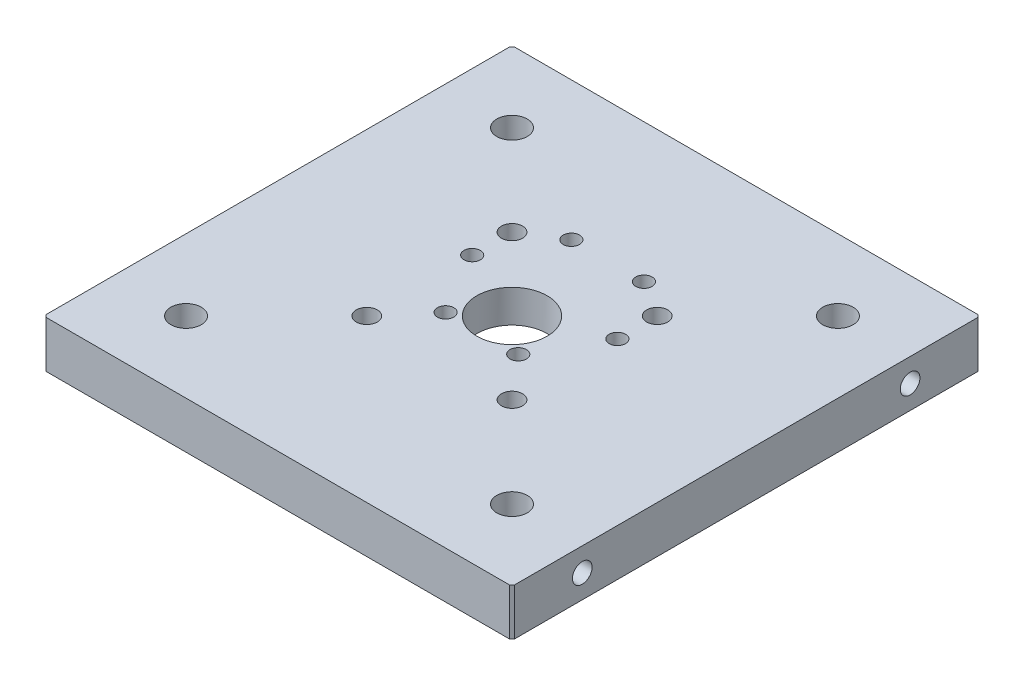
ISO-10303-21;
HEADER;
FILE_DESCRIPTION(('STEP AP214'),'2;1');
FILE_NAME('part.step','',(''),(''),'','','');
FILE_SCHEMA(('AUTOMOTIVE_DESIGN { 1 0 10303 214 1 1 1 1 }'));
ENDSEC;
DATA;
#1=APPLICATION_CONTEXT('core data for automotive mechanical design processes');
#2=APPLICATION_PROTOCOL_DEFINITION('international standard','automotive_design',2000,#1);
#3=PRODUCT_CONTEXT('',#1,'mechanical');
#4=PRODUCT('Part','Part','',(#3));
#5=PRODUCT_RELATED_PRODUCT_CATEGORY('part','',(#4));
#6=PRODUCT_DEFINITION_FORMATION('','',#4);
#7=PRODUCT_DEFINITION_CONTEXT('part definition',#1,'design');
#8=PRODUCT_DEFINITION('design','',#6,#7);
#9=PRODUCT_DEFINITION_SHAPE('','',#8);
#10=(LENGTH_UNIT() NAMED_UNIT(*) SI_UNIT(.MILLI.,.METRE.));
#11=(NAMED_UNIT(*) PLANE_ANGLE_UNIT() SI_UNIT($,.RADIAN.));
#12=(NAMED_UNIT(*) SI_UNIT($,.STERADIAN.) SOLID_ANGLE_UNIT());
#13=UNCERTAINTY_MEASURE_WITH_UNIT(LENGTH_MEASURE(1.E-05),#10,'distance_accuracy_value','');
#14=(GEOMETRIC_REPRESENTATION_CONTEXT(3) GLOBAL_UNCERTAINTY_ASSIGNED_CONTEXT((#13)) GLOBAL_UNIT_ASSIGNED_CONTEXT((#10,
#11,#12)) REPRESENTATION_CONTEXT('',''));
#15=CARTESIAN_POINT('',(0.,0.,0.));
#16=DIRECTION('',(0.,0.,1.));
#17=DIRECTION('',(1.,0.,0.));
#18=AXIS2_PLACEMENT_3D('',#15,#16,#17);
#19=CARTESIAN_POINT('',(0.,5.,0.));
#20=DIRECTION('',(0.,1.,0.));
#21=DIRECTION('',(0.,0.,1.));
#22=AXIS2_PLACEMENT_3D('',#19,#20,#21);
#23=PLANE('',#22);
#24=CARTESIAN_POINT('',(-15.5,5.,15.5));
#25=DIRECTION('',(0.,1.,0.));
#26=DIRECTION('',(0.,0.,1.));
#27=AXIS2_PLACEMENT_3D('',#24,#25,#26);
#28=CIRCLE('',#27,2.25);
#29=CARTESIAN_POINT('',(-15.5,5.,17.75));
#30=VERTEX_POINT('',#29);
#31=EDGE_CURVE('E562',#30,#30,#28,.T.);
#32=ORIENTED_EDGE('',*,*,#31,.F.);
#33=EDGE_LOOP('',(#32));
#34=FACE_BOUND('',#33,.T.);
#35=CARTESIAN_POINT('',(15.4999999999998,5.,15.5000000000002));
#36=DIRECTION('',(0.,1.,0.));
#37=DIRECTION('',(0.,0.,1.));
#38=AXIS2_PLACEMENT_3D('',#35,#36,#37);
#39=CIRCLE('',#38,2.25);
#40=CARTESIAN_POINT('',(15.4999999999998,5.,17.7500000000002));
#41=VERTEX_POINT('',#40);
#42=EDGE_CURVE('E563',#41,#41,#39,.T.);
#43=ORIENTED_EDGE('',*,*,#42,.F.);
#44=EDGE_LOOP('',(#43));
#45=FACE_BOUND('',#44,.T.);
#46=CARTESIAN_POINT('',(15.5000000000001,5.,-15.4999999999999));
#47=DIRECTION('',(0.,1.,0.));
#48=DIRECTION('',(0.,0.,1.));
#49=AXIS2_PLACEMENT_3D('',#46,#47,#48);
#50=CIRCLE('',#49,2.25);
#51=CARTESIAN_POINT('',(15.5000000000001,5.,-13.2499999999999));
#52=VERTEX_POINT('',#51);
#53=EDGE_CURVE('E565',#52,#52,#50,.T.);
#54=ORIENTED_EDGE('',*,*,#53,.F.);
#55=EDGE_LOOP('',(#54));
#56=FACE_BOUND('',#55,.T.);
#57=CARTESIAN_POINT('',(-15.4999999999999,5.,-15.5000000000001));
#58=DIRECTION('',(0.,1.,0.));
#59=DIRECTION('',(0.,0.,1.));
#60=AXIS2_PLACEMENT_3D('',#57,#58,#59);
#61=CIRCLE('',#60,2.25);
#62=CARTESIAN_POINT('',(-15.4999999999999,5.,-13.2500000000001));
#63=VERTEX_POINT('',#62);
#64=EDGE_CURVE('E270',#63,#63,#61,.T.);
#65=ORIENTED_EDGE('',*,*,#64,.F.);
#66=EDGE_LOOP('',(#65));
#67=FACE_BOUND('',#66,.T.);
#68=CARTESIAN_POINT('',(-15.5,5.,-7.));
#69=DIRECTION('',(0.,1.,0.));
#70=DIRECTION('',(0.,0.,1.));
#71=AXIS2_PLACEMENT_3D('',#68,#69,#70);
#72=CIRCLE('',#71,1.75);
#73=CARTESIAN_POINT('',(-15.5,5.,-5.25));
#74=VERTEX_POINT('',#73);
#75=EDGE_CURVE('E277',#74,#74,#72,.T.);
#76=ORIENTED_EDGE('',*,*,#75,.F.);
#77=EDGE_LOOP('',(#76));
#78=FACE_BOUND('',#77,.T.);
#79=CARTESIAN_POINT('',(-7.75000000000016,5.,6.42339375865871));
#80=DIRECTION('',(0.,1.,0.));
#81=DIRECTION('',(0.,0.,1.));
#82=AXIS2_PLACEMENT_3D('',#79,#80,#81);
#83=CIRCLE('',#82,1.75);
#84=CARTESIAN_POINT('',(-7.75000000000016,5.,8.17339375865871));
#85=VERTEX_POINT('',#84);
#86=EDGE_CURVE('E281',#85,#85,#83,.T.);
#87=ORIENTED_EDGE('',*,*,#86,.F.);
#88=EDGE_LOOP('',(#87));
#89=FACE_BOUND('',#88,.T.);
#90=CARTESIAN_POINT('',(7.74999999999987,5.,6.42339375865887));
#91=DIRECTION('',(0.,1.,0.));
#92=DIRECTION('',(0.,0.,1.));
#93=AXIS2_PLACEMENT_3D('',#90,#91,#92);
#94=CIRCLE('',#93,1.75);
#95=CARTESIAN_POINT('',(7.74999999999987,5.,8.17339375865887));
#96=VERTEX_POINT('',#95);
#97=EDGE_CURVE('E286',#96,#96,#94,.T.);
#98=ORIENTED_EDGE('',*,*,#97,.F.);
#99=EDGE_LOOP('',(#98));
#100=FACE_BOUND('',#99,.T.);
#101=DIRECTION('',(0.,0.,-1.));
#102=VECTOR('',#101,1.);
#103=CARTESIAN_POINT('',(50.,5.,-50.));
#104=LINE('',#103,#102);
#105=CARTESIAN_POINT('',(50.,5.,49.5));
#106=VERTEX_POINT('',#105);
#107=CARTESIAN_POINT('',(50.,5.,-49.5));
#108=VERTEX_POINT('',#107);
#109=EDGE_CURVE('E199',#106,#108,#104,.T.);
#110=ORIENTED_EDGE('',*,*,#109,.T.);
#111=DIRECTION('',(0.707106781186548,0.,0.707106781186548));
#112=VECTOR('',#111,1.);
#113=CARTESIAN_POINT('',(49.75,5.,-49.75));
#114=LINE('',#113,#112);
#115=CARTESIAN_POINT('',(49.5,5.,-50.));
#116=VERTEX_POINT('',#115);
#117=EDGE_CURVE('E229',#108,#116,#114,.F.);
#118=ORIENTED_EDGE('',*,*,#117,.T.);
#119=DIRECTION('',(-1.,0.,0.));
#120=VECTOR('',#119,1.);
#121=CARTESIAN_POINT('',(-50.,5.,-50.));
#122=LINE('',#121,#120);
#123=CARTESIAN_POINT('',(-49.5,5.,-50.));
#124=VERTEX_POINT('',#123);
#125=EDGE_CURVE('E202',#116,#124,#122,.T.);
#126=ORIENTED_EDGE('',*,*,#125,.T.);
#127=DIRECTION('',(0.707106781186548,0.,-0.707106781186548));
#128=VECTOR('',#127,1.);
#129=CARTESIAN_POINT('',(-49.75,5.,-49.75));
#130=LINE('',#129,#128);
#131=CARTESIAN_POINT('',(-50.,5.,-49.5));
#132=VERTEX_POINT('',#131);
#133=EDGE_CURVE('E223',#124,#132,#130,.F.);
#134=ORIENTED_EDGE('',*,*,#133,.T.);
#135=DIRECTION('',(0.,0.,1.));
#136=VECTOR('',#135,1.);
#137=CARTESIAN_POINT('',(-50.,5.,-50.));
#138=LINE('',#137,#136);
#139=CARTESIAN_POINT('',(-50.,5.,49.5));
#140=VERTEX_POINT('',#139);
#141=EDGE_CURVE('E193',#132,#140,#138,.T.);
#142=ORIENTED_EDGE('',*,*,#141,.T.);
#143=DIRECTION('',(-0.707106781186548,0.,-0.707106781186548));
#144=VECTOR('',#143,1.);
#145=CARTESIAN_POINT('',(-49.75,5.,49.75));
#146=LINE('',#145,#144);
#147=CARTESIAN_POINT('',(-49.5,5.,50.));
#148=VERTEX_POINT('',#147);
#149=EDGE_CURVE('E225',#140,#148,#146,.F.);
#150=ORIENTED_EDGE('',*,*,#149,.T.);
#151=DIRECTION('',(1.,0.,0.));
#152=VECTOR('',#151,1.);
#153=CARTESIAN_POINT('',(-50.,5.,50.));
#154=LINE('',#153,#152);
#155=CARTESIAN_POINT('',(49.5,5.,50.));
#156=VERTEX_POINT('',#155);
#157=EDGE_CURVE('E196',#148,#156,#154,.T.);
#158=ORIENTED_EDGE('',*,*,#157,.T.);
#159=DIRECTION('',(-0.707106781186548,0.,0.707106781186548));
#160=VECTOR('',#159,1.);
#161=CARTESIAN_POINT('',(49.75,5.,49.75));
#162=LINE('',#161,#160);
#163=EDGE_CURVE('E227',#156,#106,#162,.F.);
#164=ORIENTED_EDGE('',*,*,#163,.T.);
#165=EDGE_LOOP('',(#110,#118,#126,#134,#142,#150,#158,#164));
#166=FACE_BOUND('',#165,.T.);
#167=CARTESIAN_POINT('',(0.,5.,0.));
#168=DIRECTION('',(0.,1.,0.));
#169=DIRECTION('',(0.,0.,1.));
#170=AXIS2_PLACEMENT_3D('',#167,#168,#169);
#171=CIRCLE('',#170,7.5);
#172=CARTESIAN_POINT('',(0.,5.,7.5));
#173=VERTEX_POINT('',#172);
#174=EDGE_CURVE('E190',#173,#173,#171,.T.);
#175=ORIENTED_EDGE('',*,*,#174,.F.);
#176=EDGE_LOOP('',(#175));
#177=FACE_BOUND('',#176,.T.);
#178=CARTESIAN_POINT('',(-34.798492469143,5.,34.798492469143));
#179=DIRECTION('',(0.,1.,0.));
#180=DIRECTION('',(0.,0.,1.));
#181=AXIS2_PLACEMENT_3D('',#178,#179,#180);
#182=CIRCLE('',#181,3.25);
#183=CARTESIAN_POINT('',(-34.798492469143,5.,38.048492469143));
#184=VERTEX_POINT('',#183);
#185=EDGE_CURVE('E166',#184,#184,#182,.T.);
#186=ORIENTED_EDGE('',*,*,#185,.F.);
#187=EDGE_LOOP('',(#186));
#188=FACE_BOUND('',#187,.T.);
#189=CARTESIAN_POINT('',(34.798492469143,5.,34.798492469143));
#190=DIRECTION('',(0.,1.,0.));
#191=DIRECTION('',(0.,0.,-1.));
#192=AXIS2_PLACEMENT_3D('',#189,#190,#191);
#193=CIRCLE('',#192,3.25);
#194=CARTESIAN_POINT('',(34.798492469143,5.,31.548492469143));
#195=VERTEX_POINT('',#194);
#196=EDGE_CURVE('E174',#195,#195,#193,.T.);
#197=ORIENTED_EDGE('',*,*,#196,.F.);
#198=EDGE_LOOP('',(#197));
#199=FACE_BOUND('',#198,.T.);
#200=CARTESIAN_POINT('',(-34.798492469143,5.,-34.798492469143));
#201=DIRECTION('',(0.,1.,0.));
#202=DIRECTION('',(0.,0.,-1.));
#203=AXIS2_PLACEMENT_3D('',#200,#201,#202);
#204=CIRCLE('',#203,3.25);
#205=CARTESIAN_POINT('',(-34.798492469143,5.,-38.048492469143));
#206=VERTEX_POINT('',#205);
#207=EDGE_CURVE('E171',#206,#206,#204,.T.);
#208=ORIENTED_EDGE('',*,*,#207,.F.);
#209=EDGE_LOOP('',(#208));
#210=FACE_BOUND('',#209,.T.);
#211=CARTESIAN_POINT('',(34.798492469143,5.,-34.798492469143));
#212=DIRECTION('',(0.,1.,0.));
#213=DIRECTION('',(0.,0.,1.));
#214=AXIS2_PLACEMENT_3D('',#211,#212,#213);
#215=CIRCLE('',#214,3.25);
#216=CARTESIAN_POINT('',(34.798492469143,5.,-31.548492469143));
#217=VERTEX_POINT('',#216);
#218=EDGE_CURVE('E167',#217,#217,#215,.T.);
#219=ORIENTED_EDGE('',*,*,#218,.F.);
#220=EDGE_LOOP('',(#219));
#221=FACE_BOUND('',#220,.T.);
#222=CARTESIAN_POINT('',(7.75000000000006,5.,-20.4233937586588));
#223=DIRECTION('',(0.,1.,0.));
#224=DIRECTION('',(0.,0.,1.));
#225=AXIS2_PLACEMENT_3D('',#222,#223,#224);
#226=CIRCLE('',#225,1.75);
#227=CARTESIAN_POINT('',(7.75000000000006,5.,-18.6733937586588));
#228=VERTEX_POINT('',#227);
#229=EDGE_CURVE('E252',#228,#228,#226,.T.);
#230=ORIENTED_EDGE('',*,*,#229,.F.);
#231=EDGE_LOOP('',(#230));
#232=FACE_BOUND('',#231,.T.);
#233=CARTESIAN_POINT('',(-7.74999999999997,5.,-20.4233937586588));
#234=DIRECTION('',(0.,1.,0.));
#235=DIRECTION('',(0.,0.,1.));
#236=AXIS2_PLACEMENT_3D('',#233,#234,#235);
#237=CIRCLE('',#236,1.75);
#238=CARTESIAN_POINT('',(-7.74999999999997,5.,-18.6733937586588));
#239=VERTEX_POINT('',#238);
#240=EDGE_CURVE('E290',#239,#239,#237,.T.);
#241=ORIENTED_EDGE('',*,*,#240,.F.);
#242=EDGE_LOOP('',(#241));
#243=FACE_BOUND('',#242,.T.);
#244=CARTESIAN_POINT('',(15.5,5.,-7.00000000000001));
#245=DIRECTION('',(0.,-1.,0.));
#246=DIRECTION('',(0.,0.,-1.));
#247=AXIS2_PLACEMENT_3D('',#244,#245,#246);
#248=CIRCLE('',#247,1.75);
#249=CARTESIAN_POINT('',(15.5,5.,-8.75000000000001));
#250=VERTEX_POINT('',#249);
#251=EDGE_CURVE('E294',#250,#250,#248,.T.);
#252=ORIENTED_EDGE('',*,*,#251,.T.);
#253=EDGE_LOOP('',(#252));
#254=FACE_BOUND('',#253,.T.);
#255=ADVANCED_FACE('F45',(#34,#45,#56,#67,#78,#89,#100,#166,#177,#188,#199,#210,#221,#232,#243,
#254),#23,.T.);
#256=CARTESIAN_POINT('',(0.,-2.,0.));
#257=DIRECTION('',(0.,-1.,0.));
#258=DIRECTION('',(0.,0.,-1.));
#259=AXIS2_PLACEMENT_3D('',#256,#257,#258);
#260=PLANE('',#259);
#261=CARTESIAN_POINT('',(-15.5,-2.,15.5));
#262=DIRECTION('',(0.,-1.,0.));
#263=DIRECTION('',(0.,0.,-1.));
#264=AXIS2_PLACEMENT_3D('',#261,#262,#263);
#265=CIRCLE('',#264,2.25);
#266=CARTESIAN_POINT('',(-15.5,-2.,13.25));
#267=VERTEX_POINT('',#266);
#268=EDGE_CURVE('E49',#267,#267,#265,.T.);
#269=ORIENTED_EDGE('',*,*,#268,.F.);
#270=EDGE_LOOP('',(#269));
#271=FACE_BOUND('',#270,.T.);
#272=CARTESIAN_POINT('',(15.4999999999998,-2.,15.5000000000002));
#273=DIRECTION('',(0.,-1.,0.));
#274=DIRECTION('',(0.,0.,-1.));
#275=AXIS2_PLACEMENT_3D('',#272,#273,#274);
#276=CIRCLE('',#275,2.25);
#277=CARTESIAN_POINT('',(15.4999999999998,-2.,13.2500000000002));
#278=VERTEX_POINT('',#277);
#279=EDGE_CURVE('E272',#278,#278,#276,.T.);
#280=ORIENTED_EDGE('',*,*,#279,.F.);
#281=EDGE_LOOP('',(#280));
#282=FACE_BOUND('',#281,.T.);
#283=CARTESIAN_POINT('',(15.5000000000001,-2.,-15.4999999999999));
#284=DIRECTION('',(0.,-1.,0.));
#285=DIRECTION('',(0.,0.,-1.));
#286=AXIS2_PLACEMENT_3D('',#283,#284,#285);
#287=CIRCLE('',#286,2.25);
#288=CARTESIAN_POINT('',(15.5000000000001,-2.,-17.7499999999999));
#289=VERTEX_POINT('',#288);
#290=EDGE_CURVE('E269',#289,#289,#287,.T.);
#291=ORIENTED_EDGE('',*,*,#290,.F.);
#292=EDGE_LOOP('',(#291));
#293=FACE_BOUND('',#292,.T.);
#294=CARTESIAN_POINT('',(-15.4999999999999,-2.,-15.5000000000001));
#295=DIRECTION('',(0.,-1.,0.));
#296=DIRECTION('',(0.,0.,-1.));
#297=AXIS2_PLACEMENT_3D('',#294,#295,#296);
#298=CIRCLE('',#297,2.25);
#299=CARTESIAN_POINT('',(-15.4999999999999,-2.,-17.75));
#300=VERTEX_POINT('',#299);
#301=EDGE_CURVE('E266',#300,#300,#298,.T.);
#302=ORIENTED_EDGE('',*,*,#301,.F.);
#303=EDGE_LOOP('',(#302));
#304=FACE_BOUND('',#303,.T.);
#305=CARTESIAN_POINT('',(-15.5,-2.,-7.));
#306=DIRECTION('',(0.,-1.,0.));
#307=DIRECTION('',(0.,0.,-1.));
#308=AXIS2_PLACEMENT_3D('',#305,#306,#307);
#309=CIRCLE('',#308,1.75);
#310=CARTESIAN_POINT('',(-15.5,-2.,-8.75));
#311=VERTEX_POINT('',#310);
#312=EDGE_CURVE('E141',#311,#311,#309,.T.);
#313=ORIENTED_EDGE('',*,*,#312,.F.);
#314=EDGE_LOOP('',(#313));
#315=FACE_BOUND('',#314,.T.);
#316=CARTESIAN_POINT('',(-7.75000000000016,-2.,6.42339375865871));
#317=DIRECTION('',(0.,-1.,0.));
#318=DIRECTION('',(0.,0.,-1.));
#319=AXIS2_PLACEMENT_3D('',#316,#317,#318);
#320=CIRCLE('',#319,1.75);
#321=CARTESIAN_POINT('',(-7.75000000000016,-2.,4.67339375865871));
#322=VERTEX_POINT('',#321);
#323=EDGE_CURVE('E261',#322,#322,#320,.T.);
#324=ORIENTED_EDGE('',*,*,#323,.F.);
#325=EDGE_LOOP('',(#324));
#326=FACE_BOUND('',#325,.T.);
#327=CARTESIAN_POINT('',(7.74999999999987,-2.,6.42339375865887));
#328=DIRECTION('',(0.,-1.,0.));
#329=DIRECTION('',(0.,0.,-1.));
#330=AXIS2_PLACEMENT_3D('',#327,#328,#329);
#331=CIRCLE('',#330,1.75);
#332=CARTESIAN_POINT('',(7.74999999999987,-2.,4.67339375865887));
#333=VERTEX_POINT('',#332);
#334=EDGE_CURVE('E258',#333,#333,#331,.T.);
#335=ORIENTED_EDGE('',*,*,#334,.F.);
#336=EDGE_LOOP('',(#335));
#337=FACE_BOUND('',#336,.T.);
#338=CARTESIAN_POINT('',(0.,-2.,0.));
#339=DIRECTION('',(0.,-1.,0.));
#340=DIRECTION('',(0.,0.,-1.));
#341=AXIS2_PLACEMENT_3D('',#338,#339,#340);
#342=CIRCLE('',#341,7.5);
#343=CARTESIAN_POINT('',(0.,-2.,-7.5));
#344=VERTEX_POINT('',#343);
#345=EDGE_CURVE('E151',#344,#344,#342,.F.);
#346=ORIENTED_EDGE('',*,*,#345,.T.);
#347=EDGE_LOOP('',(#346));
#348=FACE_BOUND('',#347,.T.);
#349=CARTESIAN_POINT('',(0.,-2.,0.));
#350=DIRECTION('',(0.,-1.,0.));
#351=DIRECTION('',(0.,0.,-1.));
#352=AXIS2_PLACEMENT_3D('',#349,#350,#351);
#353=CIRCLE('',#352,37.5);
#354=CARTESIAN_POINT('',(0.,-2.,-37.5));
#355=VERTEX_POINT('',#354);
#356=EDGE_CURVE('E148',#355,#355,#353,.T.);
#357=ORIENTED_EDGE('',*,*,#356,.T.);
#358=EDGE_LOOP('',(#357));
#359=FACE_BOUND('',#358,.T.);
#360=CARTESIAN_POINT('',(7.75000000000006,-2.,-20.4233937586588));
#361=DIRECTION('',(0.,-1.,0.));
#362=DIRECTION('',(0.,0.,-1.));
#363=AXIS2_PLACEMENT_3D('',#360,#361,#362);
#364=CIRCLE('',#363,1.75);
#365=CARTESIAN_POINT('',(7.75000000000006,-2.,-22.1733937586588));
#366=VERTEX_POINT('',#365);
#367=EDGE_CURVE('E248',#366,#366,#364,.T.);
#368=ORIENTED_EDGE('',*,*,#367,.F.);
#369=EDGE_LOOP('',(#368));
#370=FACE_BOUND('',#369,.T.);
#371=CARTESIAN_POINT('',(-7.74999999999997,-2.,-20.4233937586588));
#372=DIRECTION('',(0.,-1.,0.));
#373=DIRECTION('',(0.,0.,-1.));
#374=AXIS2_PLACEMENT_3D('',#371,#372,#373);
#375=CIRCLE('',#374,1.75);
#376=CARTESIAN_POINT('',(-7.74999999999997,-2.,-22.1733937586588));
#377=VERTEX_POINT('',#376);
#378=EDGE_CURVE('E251',#377,#377,#375,.T.);
#379=ORIENTED_EDGE('',*,*,#378,.F.);
#380=EDGE_LOOP('',(#379));
#381=FACE_BOUND('',#380,.T.);
#382=CARTESIAN_POINT('',(15.5,-2.,-7.00000000000001));
#383=DIRECTION('',(0.,-1.,0.));
#384=DIRECTION('',(0.,0.,-1.));
#385=AXIS2_PLACEMENT_3D('',#382,#383,#384);
#386=CIRCLE('',#385,1.75);
#387=CARTESIAN_POINT('',(15.5,-2.,-8.75000000000001));
#388=VERTEX_POINT('',#387);
#389=EDGE_CURVE('E255',#388,#388,#386,.F.);
#390=ORIENTED_EDGE('',*,*,#389,.T.);
#391=EDGE_LOOP('',(#390));
#392=FACE_BOUND('',#391,.T.);
#393=ADVANCED_FACE('F309',(#271,#282,#293,#304,#315,#326,#337,#348,#359,#370,#381,#392),#260,.T.);
#394=CARTESIAN_POINT('',(0.,-7.7,0.));
#395=DIRECTION('',(0.,1.,0.));
#396=DIRECTION('',(0.,0.,1.));
#397=AXIS2_PLACEMENT_3D('',#394,#395,#396);
#398=CYLINDRICAL_SURFACE('',#397,7.5);
#399=ORIENTED_EDGE('',*,*,#174,.T.);
#400=EDGE_LOOP('',(#399));
#401=FACE_BOUND('',#400,.T.);
#402=ORIENTED_EDGE('',*,*,#345,.F.);
#403=EDGE_LOOP('',(#402));
#404=FACE_BOUND('',#403,.T.);
#405=ADVANCED_FACE('F368',(#401,#404),#398,.F.);
#406=CARTESIAN_POINT('',(-50.,-5.,-50.));
#407=DIRECTION('',(-1.,0.,0.));
#408=DIRECTION('',(0.,0.,1.));
#409=AXIS2_PLACEMENT_3D('',#406,#407,#408);
#410=PLANE('',#409);
#411=CARTESIAN_POINT('',(-50.,0.,-35.));
#412=DIRECTION('',(-1.,0.,0.));
#413=DIRECTION('',(0.,0.,1.));
#414=AXIS2_PLACEMENT_3D('',#411,#412,#413);
#415=CIRCLE('',#414,2.1);
#416=CARTESIAN_POINT('',(-50.,0.,-32.9));
#417=VERTEX_POINT('',#416);
#418=EDGE_CURVE('E154',#417,#417,#415,.T.);
#419=ORIENTED_EDGE('',*,*,#418,.F.);
#420=EDGE_LOOP('',(#419));
#421=FACE_BOUND('',#420,.T.);
#422=CARTESIAN_POINT('',(-50.,0.,35.));
#423=DIRECTION('',(-1.,0.,0.));
#424=DIRECTION('',(0.,0.,1.));
#425=AXIS2_PLACEMENT_3D('',#422,#423,#424);
#426=CIRCLE('',#425,2.1);
#427=CARTESIAN_POINT('',(-50.,0.,37.1));
#428=VERTEX_POINT('',#427);
#429=EDGE_CURVE('E160',#428,#428,#426,.T.);
#430=ORIENTED_EDGE('',*,*,#429,.F.);
#431=EDGE_LOOP('',(#430));
#432=FACE_BOUND('',#431,.T.);
#433=DIRECTION('',(0.,0.,1.));
#434=VECTOR('',#433,1.);
#435=CARTESIAN_POINT('',(-50.,-5.,-50.));
#436=LINE('',#435,#434);
#437=CARTESIAN_POINT('',(-50.,-5.,-49.5));
#438=VERTEX_POINT('',#437);
#439=CARTESIAN_POINT('',(-50.,-5.,49.5));
#440=VERTEX_POINT('',#439);
#441=EDGE_CURVE('E205',#438,#440,#436,.T.);
#442=ORIENTED_EDGE('',*,*,#441,.T.);
#443=DIRECTION('',(0.,1.,0.));
#444=VECTOR('',#443,1.);
#445=CARTESIAN_POINT('',(-50.,-5.,49.5));
#446=LINE('',#445,#444);
#447=EDGE_CURVE('E13',#440,#140,#446,.T.);
#448=ORIENTED_EDGE('',*,*,#447,.T.);
#449=ORIENTED_EDGE('',*,*,#141,.F.);
#450=DIRECTION('',(0.,-1.,0.));
#451=VECTOR('',#450,1.);
#452=CARTESIAN_POINT('',(-50.,-5.,-49.5));
#453=LINE('',#452,#451);
#454=EDGE_CURVE('E54',#132,#438,#453,.T.);
#455=ORIENTED_EDGE('',*,*,#454,.T.);
#456=EDGE_LOOP('',(#442,#448,#449,#455));
#457=FACE_BOUND('',#456,.T.);
#458=ADVANCED_FACE('F409',(#421,#432,#457),#410,.T.);
#459=CARTESIAN_POINT('',(-50.,-5.,-50.));
#460=DIRECTION('',(0.,0.,-1.));
#461=DIRECTION('',(-1.,0.,0.));
#462=AXIS2_PLACEMENT_3D('',#459,#460,#461);
#463=PLANE('',#462);
#464=ORIENTED_EDGE('',*,*,#125,.F.);
#465=DIRECTION('',(0.,-1.,0.));
#466=VECTOR('',#465,1.);
#467=CARTESIAN_POINT('',(49.5,-5.,-50.));
#468=LINE('',#467,#466);
#469=CARTESIAN_POINT('',(49.5,-5.,-50.));
#470=VERTEX_POINT('',#469);
#471=EDGE_CURVE('E234',#116,#470,#468,.T.);
#472=ORIENTED_EDGE('',*,*,#471,.T.);
#473=DIRECTION('',(-1.,0.,0.));
#474=VECTOR('',#473,1.);
#475=CARTESIAN_POINT('',(-50.,-5.,-50.));
#476=LINE('',#475,#474);
#477=CARTESIAN_POINT('',(-49.5,-5.,-50.));
#478=VERTEX_POINT('',#477);
#479=EDGE_CURVE('E213',#470,#478,#476,.T.);
#480=ORIENTED_EDGE('',*,*,#479,.T.);
#481=DIRECTION('',(0.,1.,0.));
#482=VECTOR('',#481,1.);
#483=CARTESIAN_POINT('',(-49.5,-5.,-50.));
#484=LINE('',#483,#482);
#485=EDGE_CURVE('E231',#478,#124,#484,.T.);
#486=ORIENTED_EDGE('',*,*,#485,.T.);
#487=EDGE_LOOP('',(#464,#472,#480,#486));
#488=FACE_BOUND('',#487,.T.);
#489=ADVANCED_FACE('F416',(#488),#463,.T.);
#490=CARTESIAN_POINT('',(50.,-5.,-50.));
#491=DIRECTION('',(1.,0.,0.));
#492=DIRECTION('',(0.,0.,-1.));
#493=AXIS2_PLACEMENT_3D('',#490,#491,#492);
#494=PLANE('',#493);
#495=CARTESIAN_POINT('',(50.,0.,-35.));
#496=DIRECTION('',(1.,0.,0.));
#497=DIRECTION('',(0.,0.,-1.));
#498=AXIS2_PLACEMENT_3D('',#495,#496,#497);
#499=CIRCLE('',#498,2.1);
#500=CARTESIAN_POINT('',(50.,0.,-37.1));
#501=VERTEX_POINT('',#500);
#502=EDGE_CURVE('E135',#501,#501,#499,.T.);
#503=ORIENTED_EDGE('',*,*,#502,.F.);
#504=EDGE_LOOP('',(#503));
#505=FACE_BOUND('',#504,.T.);
#506=CARTESIAN_POINT('',(50.,0.,35.));
#507=DIRECTION('',(1.,0.,0.));
#508=DIRECTION('',(0.,0.,-1.));
#509=AXIS2_PLACEMENT_3D('',#506,#507,#508);
#510=CIRCLE('',#509,2.1);
#511=CARTESIAN_POINT('',(50.,0.,32.9));
#512=VERTEX_POINT('',#511);
#513=EDGE_CURVE('E134',#512,#512,#510,.T.);
#514=ORIENTED_EDGE('',*,*,#513,.F.);
#515=EDGE_LOOP('',(#514));
#516=FACE_BOUND('',#515,.T.);
#517=DIRECTION('',(0.,0.,-1.));
#518=VECTOR('',#517,1.);
#519=CARTESIAN_POINT('',(50.,-5.,-50.));
#520=LINE('',#519,#518);
#521=CARTESIAN_POINT('',(50.,-5.,49.5));
#522=VERTEX_POINT('',#521);
#523=CARTESIAN_POINT('',(50.,-5.,-49.5));
#524=VERTEX_POINT('',#523);
#525=EDGE_CURVE('E210',#522,#524,#520,.T.);
#526=ORIENTED_EDGE('',*,*,#525,.T.);
#527=DIRECTION('',(0.,1.,0.));
#528=VECTOR('',#527,1.);
#529=CARTESIAN_POINT('',(50.,-5.,-49.5));
#530=LINE('',#529,#528);
#531=EDGE_CURVE('E220',#524,#108,#530,.T.);
#532=ORIENTED_EDGE('',*,*,#531,.T.);
#533=ORIENTED_EDGE('',*,*,#109,.F.);
#534=DIRECTION('',(0.,-1.,0.));
#535=VECTOR('',#534,1.);
#536=CARTESIAN_POINT('',(50.,-5.,49.5));
#537=LINE('',#536,#535);
#538=EDGE_CURVE('E216',#106,#522,#537,.T.);
#539=ORIENTED_EDGE('',*,*,#538,.T.);
#540=EDGE_LOOP('',(#526,#532,#533,#539));
#541=FACE_BOUND('',#540,.T.);
#542=ADVANCED_FACE('F419',(#505,#516,#541),#494,.T.);
#543=CARTESIAN_POINT('',(-50.,-5.,50.));
#544=DIRECTION('',(0.,0.,1.));
#545=DIRECTION('',(1.,0.,0.));
#546=AXIS2_PLACEMENT_3D('',#543,#544,#545);
#547=PLANE('',#546);
#548=DIRECTION('',(1.,0.,0.));
#549=VECTOR('',#548,1.);
#550=CARTESIAN_POINT('',(-50.,-5.,50.));
#551=LINE('',#550,#549);
#552=CARTESIAN_POINT('',(-49.5,-5.,50.));
#553=VERTEX_POINT('',#552);
#554=CARTESIAN_POINT('',(49.5,-5.,50.));
#555=VERTEX_POINT('',#554);
#556=EDGE_CURVE('E208',#553,#555,#551,.T.);
#557=ORIENTED_EDGE('',*,*,#556,.T.);
#558=DIRECTION('',(0.,1.,0.));
#559=VECTOR('',#558,1.);
#560=CARTESIAN_POINT('',(49.5,-5.,50.));
#561=LINE('',#560,#559);
#562=EDGE_CURVE('E244',#555,#156,#561,.T.);
#563=ORIENTED_EDGE('',*,*,#562,.T.);
#564=ORIENTED_EDGE('',*,*,#157,.F.);
#565=DIRECTION('',(0.,-1.,0.));
#566=VECTOR('',#565,1.);
#567=CARTESIAN_POINT('',(-49.5,-5.,50.));
#568=LINE('',#567,#566);
#569=EDGE_CURVE('E69',#148,#553,#568,.T.);
#570=ORIENTED_EDGE('',*,*,#569,.T.);
#571=EDGE_LOOP('',(#557,#563,#564,#570));
#572=FACE_BOUND('',#571,.T.);
#573=ADVANCED_FACE('F414',(#572),#547,.T.);
#574=CARTESIAN_POINT('',(0.,-5.,0.));
#575=DIRECTION('',(0.,1.,0.));
#576=DIRECTION('',(0.,0.,1.));
#577=AXIS2_PLACEMENT_3D('',#574,#575,#576);
#578=PLANE('',#577);
#579=CARTESIAN_POINT('',(0.,-5.,0.));
#580=DIRECTION('',(0.,-1.,0.));
#581=DIRECTION('',(0.,0.,-1.));
#582=AXIS2_PLACEMENT_3D('',#579,#580,#581);
#583=CIRCLE('',#582,37.5);
#584=CARTESIAN_POINT('',(0.,-5.,-37.5));
#585=VERTEX_POINT('',#584);
#586=EDGE_CURVE('E147',#585,#585,#583,.T.);
#587=ORIENTED_EDGE('',*,*,#586,.F.);
#588=EDGE_LOOP('',(#587));
#589=FACE_BOUND('',#588,.T.);
#590=CARTESIAN_POINT('',(34.798492469143,-5.,-34.798492469143));
#591=DIRECTION('',(0.,1.,0.));
#592=DIRECTION('',(0.,0.,1.));
#593=AXIS2_PLACEMENT_3D('',#590,#591,#592);
#594=CIRCLE('',#593,3.25);
#595=CARTESIAN_POINT('',(34.798492469143,-5.,-31.548492469143));
#596=VERTEX_POINT('',#595);
#597=EDGE_CURVE('E187',#596,#596,#594,.T.);
#598=ORIENTED_EDGE('',*,*,#597,.T.);
#599=EDGE_LOOP('',(#598));
#600=FACE_BOUND('',#599,.T.);
#601=CARTESIAN_POINT('',(-34.798492469143,-5.,-34.798492469143));
#602=DIRECTION('',(0.,1.,0.));
#603=DIRECTION('',(0.,0.,1.));
#604=AXIS2_PLACEMENT_3D('',#601,#602,#603);
#605=CIRCLE('',#604,3.25);
#606=CARTESIAN_POINT('',(-34.798492469143,-5.,-31.548492469143));
#607=VERTEX_POINT('',#606);
#608=EDGE_CURVE('E184',#607,#607,#605,.T.);
#609=ORIENTED_EDGE('',*,*,#608,.T.);
#610=EDGE_LOOP('',(#609));
#611=FACE_BOUND('',#610,.T.);
#612=CARTESIAN_POINT('',(34.798492469143,-5.,34.798492469143));
#613=DIRECTION('',(0.,1.,0.));
#614=DIRECTION('',(0.,0.,1.));
#615=AXIS2_PLACEMENT_3D('',#612,#613,#614);
#616=CIRCLE('',#615,3.25);
#617=CARTESIAN_POINT('',(34.798492469143,-5.,38.048492469143));
#618=VERTEX_POINT('',#617);
#619=EDGE_CURVE('E181',#618,#618,#616,.T.);
#620=ORIENTED_EDGE('',*,*,#619,.T.);
#621=EDGE_LOOP('',(#620));
#622=FACE_BOUND('',#621,.T.);
#623=CARTESIAN_POINT('',(-34.798492469143,-5.,34.798492469143));
#624=DIRECTION('',(0.,1.,0.));
#625=DIRECTION('',(0.,0.,1.));
#626=AXIS2_PLACEMENT_3D('',#623,#624,#625);
#627=CIRCLE('',#626,3.25);
#628=CARTESIAN_POINT('',(-34.798492469143,-5.,38.048492469143));
#629=VERTEX_POINT('',#628);
#630=EDGE_CURVE('E170',#629,#629,#627,.T.);
#631=ORIENTED_EDGE('',*,*,#630,.T.);
#632=EDGE_LOOP('',(#631));
#633=FACE_BOUND('',#632,.T.);
#634=ORIENTED_EDGE('',*,*,#479,.F.);
#635=DIRECTION('',(-0.707106781186548,0.,-0.707106781186548));
#636=VECTOR('',#635,1.);
#637=CARTESIAN_POINT('',(50.,-5.,-49.5));
#638=LINE('',#637,#636);
#639=EDGE_CURVE('E241',#470,#524,#638,.F.);
#640=ORIENTED_EDGE('',*,*,#639,.T.);
#641=ORIENTED_EDGE('',*,*,#525,.F.);
#642=DIRECTION('',(0.707106781186548,0.,-0.707106781186548));
#643=VECTOR('',#642,1.);
#644=CARTESIAN_POINT('',(49.5,-5.,50.));
#645=LINE('',#644,#643);
#646=EDGE_CURVE('E62',#522,#555,#645,.F.);
#647=ORIENTED_EDGE('',*,*,#646,.T.);
#648=ORIENTED_EDGE('',*,*,#556,.F.);
#649=DIRECTION('',(0.707106781186548,0.,0.707106781186548));
#650=VECTOR('',#649,1.);
#651=CARTESIAN_POINT('',(-50.,-5.,49.5));
#652=LINE('',#651,#650);
#653=EDGE_CURVE('E238',#553,#440,#652,.F.);
#654=ORIENTED_EDGE('',*,*,#653,.T.);
#655=ORIENTED_EDGE('',*,*,#441,.F.);
#656=DIRECTION('',(-0.707106781186548,0.,0.707106781186548));
#657=VECTOR('',#656,1.);
#658=CARTESIAN_POINT('',(-49.5,-5.,-50.));
#659=LINE('',#658,#657);
#660=EDGE_CURVE('E236',#438,#478,#659,.F.);
#661=ORIENTED_EDGE('',*,*,#660,.T.);
#662=EDGE_LOOP('',(#634,#640,#641,#647,#648,#654,#655,#661));
#663=FACE_BOUND('',#662,.T.);
#664=ADVANCED_FACE('F406',(#589,#600,#611,#622,#633,#663),#578,.F.);
#665=CARTESIAN_POINT('',(-34.798492469143,-7.7,34.798492469143));
#666=DIRECTION('',(0.,1.,0.));
#667=DIRECTION('',(0.,0.,1.));
#668=AXIS2_PLACEMENT_3D('',#665,#666,#667);
#669=CYLINDRICAL_SURFACE('',#668,3.25);
#670=ORIENTED_EDGE('',*,*,#185,.T.);
#671=EDGE_LOOP('',(#670));
#672=FACE_BOUND('',#671,.T.);
#673=ORIENTED_EDGE('',*,*,#630,.F.);
#674=EDGE_LOOP('',(#673));
#675=FACE_BOUND('',#674,.T.);
#676=ADVANCED_FACE('F402',(#672,#675),#669,.F.);
#677=CARTESIAN_POINT('',(34.798492469143,-7.7,34.798492469143));
#678=DIRECTION('',(0.,1.,0.));
#679=DIRECTION('',(0.,0.,1.));
#680=AXIS2_PLACEMENT_3D('',#677,#678,#679);
#681=CYLINDRICAL_SURFACE('',#680,3.25);
#682=ORIENTED_EDGE('',*,*,#196,.T.);
#683=EDGE_LOOP('',(#682));
#684=FACE_BOUND('',#683,.T.);
#685=ORIENTED_EDGE('',*,*,#619,.F.);
#686=EDGE_LOOP('',(#685));
#687=FACE_BOUND('',#686,.T.);
#688=ADVANCED_FACE('F398',(#684,#687),#681,.F.);
#689=CARTESIAN_POINT('',(-34.798492469143,-7.7,-34.798492469143));
#690=DIRECTION('',(0.,1.,0.));
#691=DIRECTION('',(0.,0.,1.));
#692=AXIS2_PLACEMENT_3D('',#689,#690,#691);
#693=CYLINDRICAL_SURFACE('',#692,3.25);
#694=ORIENTED_EDGE('',*,*,#207,.T.);
#695=EDGE_LOOP('',(#694));
#696=FACE_BOUND('',#695,.T.);
#697=ORIENTED_EDGE('',*,*,#608,.F.);
#698=EDGE_LOOP('',(#697));
#699=FACE_BOUND('',#698,.T.);
#700=ADVANCED_FACE('F394',(#696,#699),#693,.F.);
#701=CARTESIAN_POINT('',(34.798492469143,-7.7,-34.798492469143));
#702=DIRECTION('',(0.,1.,0.));
#703=DIRECTION('',(0.,0.,1.));
#704=AXIS2_PLACEMENT_3D('',#701,#702,#703);
#705=CYLINDRICAL_SURFACE('',#704,3.25);
#706=ORIENTED_EDGE('',*,*,#218,.T.);
#707=EDGE_LOOP('',(#706));
#708=FACE_BOUND('',#707,.T.);
#709=ORIENTED_EDGE('',*,*,#597,.F.);
#710=EDGE_LOOP('',(#709));
#711=FACE_BOUND('',#710,.T.);
#712=ADVANCED_FACE('F390',(#708,#711),#705,.F.);
#713=CARTESIAN_POINT('',(-40.,0.,35.));
#714=DIRECTION('',(-1.,0.,0.));
#715=DIRECTION('',(0.,0.,1.));
#716=AXIS2_PLACEMENT_3D('',#713,#714,#715);
#717=CONICAL_SURFACE('',#716,2.1,1.02974425867665);
#718=CARTESIAN_POINT('',(-38.7381927000421,0.,35.));
#719=VERTEX_POINT('',#718);
#720=VERTEX_LOOP('',#719);
#721=FACE_BOUND('',#720,.T.);
#722=CARTESIAN_POINT('',(-40.,0.,35.));
#723=DIRECTION('',(-1.,0.,0.));
#724=DIRECTION('',(0.,0.,1.));
#725=AXIS2_PLACEMENT_3D('',#722,#723,#724);
#726=CIRCLE('',#725,2.1);
#727=CARTESIAN_POINT('',(-40.,0.,37.1));
#728=VERTEX_POINT('',#727);
#729=EDGE_CURVE('E163',#728,#728,#726,.T.);
#730=ORIENTED_EDGE('',*,*,#729,.T.);
#731=EDGE_LOOP('',(#730));
#732=FACE_BOUND('',#731,.T.);
#733=ADVANCED_FACE('F386',(#721,#732),#717,.F.);
#734=CARTESIAN_POINT('',(-50.,0.,35.));
#735=DIRECTION('',(-1.,0.,0.));
#736=DIRECTION('',(0.,0.,1.));
#737=AXIS2_PLACEMENT_3D('',#734,#735,#736);
#738=CYLINDRICAL_SURFACE('',#737,2.1);
#739=ORIENTED_EDGE('',*,*,#729,.F.);
#740=EDGE_LOOP('',(#739));
#741=FACE_BOUND('',#740,.T.);
#742=ORIENTED_EDGE('',*,*,#429,.T.);
#743=EDGE_LOOP('',(#742));
#744=FACE_BOUND('',#743,.T.);
#745=ADVANCED_FACE('F382',(#741,#744),#738,.F.);
#746=CARTESIAN_POINT('',(-40.,0.,-35.));
#747=DIRECTION('',(-1.,0.,0.));
#748=DIRECTION('',(0.,0.,1.));
#749=AXIS2_PLACEMENT_3D('',#746,#747,#748);
#750=CONICAL_SURFACE('',#749,2.1,1.02974425867665);
#751=CARTESIAN_POINT('',(-38.7381927000421,0.,-35.));
#752=VERTEX_POINT('',#751);
#753=VERTEX_LOOP('',#752);
#754=FACE_BOUND('',#753,.T.);
#755=CARTESIAN_POINT('',(-40.,0.,-35.));
#756=DIRECTION('',(-1.,0.,0.));
#757=DIRECTION('',(0.,0.,1.));
#758=AXIS2_PLACEMENT_3D('',#755,#756,#757);
#759=CIRCLE('',#758,2.1);
#760=CARTESIAN_POINT('',(-40.,0.,-32.9));
#761=VERTEX_POINT('',#760);
#762=EDGE_CURVE('E157',#761,#761,#759,.T.);
#763=ORIENTED_EDGE('',*,*,#762,.T.);
#764=EDGE_LOOP('',(#763));
#765=FACE_BOUND('',#764,.T.);
#766=ADVANCED_FACE('F378',(#754,#765),#750,.F.);
#767=CARTESIAN_POINT('',(-50.,0.,-35.));
#768=DIRECTION('',(-1.,0.,0.));
#769=DIRECTION('',(0.,0.,1.));
#770=AXIS2_PLACEMENT_3D('',#767,#768,#769);
#771=CYLINDRICAL_SURFACE('',#770,2.1);
#772=ORIENTED_EDGE('',*,*,#762,.F.);
#773=EDGE_LOOP('',(#772));
#774=FACE_BOUND('',#773,.T.);
#775=ORIENTED_EDGE('',*,*,#418,.T.);
#776=EDGE_LOOP('',(#775));
#777=FACE_BOUND('',#776,.T.);
#778=ADVANCED_FACE('F374',(#774,#777),#771,.F.);
#779=CARTESIAN_POINT('',(0.,-2.,0.));
#780=DIRECTION('',(0.,-1.,0.));
#781=DIRECTION('',(0.,0.,-1.));
#782=AXIS2_PLACEMENT_3D('',#779,#780,#781);
#783=CYLINDRICAL_SURFACE('',#782,37.5);
#784=ORIENTED_EDGE('',*,*,#356,.F.);
#785=EDGE_LOOP('',(#784));
#786=FACE_BOUND('',#785,.T.);
#787=ORIENTED_EDGE('',*,*,#586,.T.);
#788=EDGE_LOOP('',(#787));
#789=FACE_BOUND('',#788,.T.);
#790=ADVANCED_FACE('F370',(#786,#789),#783,.F.);
#791=CARTESIAN_POINT('',(50.,-5.,-49.5));
#792=DIRECTION('',(-0.707106781186548,0.,0.707106781186548));
#793=DIRECTION('',(0.,1.,0.));
#794=AXIS2_PLACEMENT_3D('',#791,#792,#793);
#795=PLANE('',#794);
#796=ORIENTED_EDGE('',*,*,#639,.F.);
#797=ORIENTED_EDGE('',*,*,#471,.F.);
#798=ORIENTED_EDGE('',*,*,#117,.F.);
#799=ORIENTED_EDGE('',*,*,#531,.F.);
#800=EDGE_LOOP('',(#796,#797,#798,#799));
#801=FACE_BOUND('',#800,.T.);
#802=ADVANCED_FACE('F373',(#801),#795,.F.);
#803=CARTESIAN_POINT('',(49.5,-5.,50.));
#804=DIRECTION('',(-0.707106781186547,0.,-0.707106781186547));
#805=DIRECTION('',(0.,1.,0.));
#806=AXIS2_PLACEMENT_3D('',#803,#804,#805);
#807=PLANE('',#806);
#808=ORIENTED_EDGE('',*,*,#646,.F.);
#809=ORIENTED_EDGE('',*,*,#538,.F.);
#810=ORIENTED_EDGE('',*,*,#163,.F.);
#811=ORIENTED_EDGE('',*,*,#562,.F.);
#812=EDGE_LOOP('',(#808,#809,#810,#811));
#813=FACE_BOUND('',#812,.T.);
#814=ADVANCED_FACE('F431',(#813),#807,.F.);
#815=CARTESIAN_POINT('',(-50.,-5.,49.5));
#816=DIRECTION('',(0.707106781186547,0.,-0.707106781186547));
#817=DIRECTION('',(0.,1.,0.));
#818=AXIS2_PLACEMENT_3D('',#815,#816,#817);
#819=PLANE('',#818);
#820=ORIENTED_EDGE('',*,*,#653,.F.);
#821=ORIENTED_EDGE('',*,*,#569,.F.);
#822=ORIENTED_EDGE('',*,*,#149,.F.);
#823=ORIENTED_EDGE('',*,*,#447,.F.);
#824=EDGE_LOOP('',(#820,#821,#822,#823));
#825=FACE_BOUND('',#824,.T.);
#826=ADVANCED_FACE('F434',(#825),#819,.F.);
#827=CARTESIAN_POINT('',(-49.5,-5.,-50.));
#828=DIRECTION('',(0.707106781186547,0.,0.707106781186547));
#829=DIRECTION('',(0.,1.,0.));
#830=AXIS2_PLACEMENT_3D('',#827,#828,#829);
#831=PLANE('',#830);
#832=ORIENTED_EDGE('',*,*,#660,.F.);
#833=ORIENTED_EDGE('',*,*,#454,.F.);
#834=ORIENTED_EDGE('',*,*,#133,.F.);
#835=ORIENTED_EDGE('',*,*,#485,.F.);
#836=EDGE_LOOP('',(#832,#833,#834,#835));
#837=FACE_BOUND('',#836,.T.);
#838=ADVANCED_FACE('F47',(#837),#831,.F.);
#839=CARTESIAN_POINT('',(40.,0.,35.));
#840=DIRECTION('',(1.,0.,0.));
#841=DIRECTION('',(0.,0.,-1.));
#842=AXIS2_PLACEMENT_3D('',#839,#840,#841);
#843=CONICAL_SURFACE('',#842,2.1,1.02974425867665);
#844=CARTESIAN_POINT('',(38.7381927000421,0.,35.));
#845=VERTEX_POINT('',#844);
#846=VERTEX_LOOP('',#845);
#847=FACE_BOUND('',#846,.T.);
#848=CARTESIAN_POINT('',(40.,0.,35.));
#849=DIRECTION('',(1.,0.,0.));
#850=DIRECTION('',(0.,0.,-1.));
#851=AXIS2_PLACEMENT_3D('',#848,#849,#850);
#852=CIRCLE('',#851,2.1);
#853=CARTESIAN_POINT('',(40.,0.,32.9));
#854=VERTEX_POINT('',#853);
#855=EDGE_CURVE('E138',#854,#854,#852,.T.);
#856=ORIENTED_EDGE('',*,*,#855,.T.);
#857=EDGE_LOOP('',(#856));
#858=FACE_BOUND('',#857,.T.);
#859=ADVANCED_FACE('F361',(#847,#858),#843,.F.);
#860=CARTESIAN_POINT('',(50.,0.,35.));
#861=DIRECTION('',(1.,0.,0.));
#862=DIRECTION('',(0.,0.,-1.));
#863=AXIS2_PLACEMENT_3D('',#860,#861,#862);
#864=CYLINDRICAL_SURFACE('',#863,2.1);
#865=ORIENTED_EDGE('',*,*,#855,.F.);
#866=EDGE_LOOP('',(#865));
#867=FACE_BOUND('',#866,.T.);
#868=ORIENTED_EDGE('',*,*,#513,.T.);
#869=EDGE_LOOP('',(#868));
#870=FACE_BOUND('',#869,.T.);
#871=ADVANCED_FACE('F128',(#867,#870),#864,.F.);
#872=CARTESIAN_POINT('',(40.,0.,-35.));
#873=DIRECTION('',(1.,0.,0.));
#874=DIRECTION('',(0.,0.,-1.));
#875=AXIS2_PLACEMENT_3D('',#872,#873,#874);
#876=CONICAL_SURFACE('',#875,2.1,1.02974425867665);
#877=CARTESIAN_POINT('',(38.7381927000421,0.,-35.));
#878=VERTEX_POINT('',#877);
#879=VERTEX_LOOP('',#878);
#880=FACE_BOUND('',#879,.T.);
#881=CARTESIAN_POINT('',(40.,0.,-35.));
#882=DIRECTION('',(1.,0.,0.));
#883=DIRECTION('',(0.,0.,-1.));
#884=AXIS2_PLACEMENT_3D('',#881,#882,#883);
#885=CIRCLE('',#884,2.1);
#886=CARTESIAN_POINT('',(40.,0.,-37.1));
#887=VERTEX_POINT('',#886);
#888=EDGE_CURVE('E132',#887,#887,#885,.T.);
#889=ORIENTED_EDGE('',*,*,#888,.T.);
#890=EDGE_LOOP('',(#889));
#891=FACE_BOUND('',#890,.T.);
#892=ADVANCED_FACE('F124',(#880,#891),#876,.F.);
#893=CARTESIAN_POINT('',(50.,0.,-35.));
#894=DIRECTION('',(1.,0.,0.));
#895=DIRECTION('',(0.,0.,-1.));
#896=AXIS2_PLACEMENT_3D('',#893,#894,#895);
#897=CYLINDRICAL_SURFACE('',#896,2.1);
#898=ORIENTED_EDGE('',*,*,#888,.F.);
#899=EDGE_LOOP('',(#898));
#900=FACE_BOUND('',#899,.T.);
#901=ORIENTED_EDGE('',*,*,#502,.T.);
#902=EDGE_LOOP('',(#901));
#903=FACE_BOUND('',#902,.T.);
#904=ADVANCED_FACE('F127',(#900,#903),#897,.F.);
#905=CARTESIAN_POINT('',(7.75000000000006,-5.,-20.4233937586588));
#906=DIRECTION('',(0.,1.,0.));
#907=DIRECTION('',(0.,0.,1.));
#908=AXIS2_PLACEMENT_3D('',#905,#906,#907);
#909=CYLINDRICAL_SURFACE('',#908,1.75);
#910=ORIENTED_EDGE('',*,*,#367,.T.);
#911=EDGE_LOOP('',(#910));
#912=FACE_BOUND('',#911,.T.);
#913=ORIENTED_EDGE('',*,*,#229,.T.);
#914=EDGE_LOOP('',(#913));
#915=FACE_BOUND('',#914,.T.);
#916=ADVANCED_FACE('F340',(#912,#915),#909,.F.);
#917=CARTESIAN_POINT('',(-7.74999999999997,-5.,-20.4233937586588));
#918=DIRECTION('',(0.,1.,0.));
#919=DIRECTION('',(0.,0.,1.));
#920=AXIS2_PLACEMENT_3D('',#917,#918,#919);
#921=CYLINDRICAL_SURFACE('',#920,1.75);
#922=ORIENTED_EDGE('',*,*,#378,.T.);
#923=EDGE_LOOP('',(#922));
#924=FACE_BOUND('',#923,.T.);
#925=ORIENTED_EDGE('',*,*,#240,.T.);
#926=EDGE_LOOP('',(#925));
#927=FACE_BOUND('',#926,.T.);
#928=ADVANCED_FACE('F330',(#924,#927),#921,.F.);
#929=CARTESIAN_POINT('',(15.5,-5.,-7.00000000000001));
#930=DIRECTION('',(0.,1.,0.));
#931=DIRECTION('',(0.,0.,1.));
#932=AXIS2_PLACEMENT_3D('',#929,#930,#931);
#933=CYLINDRICAL_SURFACE('',#932,1.75);
#934=ORIENTED_EDGE('',*,*,#389,.F.);
#935=EDGE_LOOP('',(#934));
#936=FACE_BOUND('',#935,.T.);
#937=ORIENTED_EDGE('',*,*,#251,.F.);
#938=EDGE_LOOP('',(#937));
#939=FACE_BOUND('',#938,.T.);
#940=ADVANCED_FACE('F328',(#936,#939),#933,.F.);
#941=CARTESIAN_POINT('',(7.74999999999987,-5.,6.42339375865887));
#942=DIRECTION('',(0.,1.,0.));
#943=DIRECTION('',(0.,0.,1.));
#944=AXIS2_PLACEMENT_3D('',#941,#942,#943);
#945=CYLINDRICAL_SURFACE('',#944,1.75);
#946=ORIENTED_EDGE('',*,*,#334,.T.);
#947=EDGE_LOOP('',(#946));
#948=FACE_BOUND('',#947,.T.);
#949=ORIENTED_EDGE('',*,*,#97,.T.);
#950=EDGE_LOOP('',(#949));
#951=FACE_BOUND('',#950,.T.);
#952=ADVANCED_FACE('F305',(#948,#951),#945,.F.);
#953=CARTESIAN_POINT('',(-7.75000000000016,-5.,6.42339375865871));
#954=DIRECTION('',(0.,1.,0.));
#955=DIRECTION('',(0.,0.,1.));
#956=AXIS2_PLACEMENT_3D('',#953,#954,#955);
#957=CYLINDRICAL_SURFACE('',#956,1.75);
#958=ORIENTED_EDGE('',*,*,#323,.T.);
#959=EDGE_LOOP('',(#958));
#960=FACE_BOUND('',#959,.T.);
#961=ORIENTED_EDGE('',*,*,#86,.T.);
#962=EDGE_LOOP('',(#961));
#963=FACE_BOUND('',#962,.T.);
#964=ADVANCED_FACE('F337',(#960,#963),#957,.F.);
#965=CARTESIAN_POINT('',(-15.5,-5.,-7.));
#966=DIRECTION('',(0.,1.,0.));
#967=DIRECTION('',(0.,0.,1.));
#968=AXIS2_PLACEMENT_3D('',#965,#966,#967);
#969=CYLINDRICAL_SURFACE('',#968,1.75);
#970=ORIENTED_EDGE('',*,*,#312,.T.);
#971=EDGE_LOOP('',(#970));
#972=FACE_BOUND('',#971,.T.);
#973=ORIENTED_EDGE('',*,*,#75,.T.);
#974=EDGE_LOOP('',(#973));
#975=FACE_BOUND('',#974,.T.);
#976=ADVANCED_FACE('F348',(#972,#975),#969,.F.);
#977=CARTESIAN_POINT('',(-15.4999999999999,-5.,-15.5000000000001));
#978=DIRECTION('',(0.,1.,0.));
#979=DIRECTION('',(0.,0.,1.));
#980=AXIS2_PLACEMENT_3D('',#977,#978,#979);
#981=CYLINDRICAL_SURFACE('',#980,2.25);
#982=ORIENTED_EDGE('',*,*,#301,.T.);
#983=EDGE_LOOP('',(#982));
#984=FACE_BOUND('',#983,.T.);
#985=ORIENTED_EDGE('',*,*,#64,.T.);
#986=EDGE_LOOP('',(#985));
#987=FACE_BOUND('',#986,.T.);
#988=ADVANCED_FACE('F352',(#984,#987),#981,.F.);
#989=CARTESIAN_POINT('',(15.5000000000001,-5.,-15.4999999999999));
#990=DIRECTION('',(0.,1.,0.));
#991=DIRECTION('',(0.,0.,1.));
#992=AXIS2_PLACEMENT_3D('',#989,#990,#991);
#993=CYLINDRICAL_SURFACE('',#992,2.25);
#994=ORIENTED_EDGE('',*,*,#290,.T.);
#995=EDGE_LOOP('',(#994));
#996=FACE_BOUND('',#995,.T.);
#997=ORIENTED_EDGE('',*,*,#53,.T.);
#998=EDGE_LOOP('',(#997));
#999=FACE_BOUND('',#998,.T.);
#1000=ADVANCED_FACE('F528',(#996,#999),#993,.F.);
#1001=CARTESIAN_POINT('',(15.4999999999998,-5.,15.5000000000002));
#1002=DIRECTION('',(0.,1.,0.));
#1003=DIRECTION('',(0.,0.,1.));
#1004=AXIS2_PLACEMENT_3D('',#1001,#1002,#1003);
#1005=CYLINDRICAL_SURFACE('',#1004,2.25);
#1006=ORIENTED_EDGE('',*,*,#279,.T.);
#1007=EDGE_LOOP('',(#1006));
#1008=FACE_BOUND('',#1007,.T.);
#1009=ORIENTED_EDGE('',*,*,#42,.T.);
#1010=EDGE_LOOP('',(#1009));
#1011=FACE_BOUND('',#1010,.T.);
#1012=ADVANCED_FACE('F537',(#1008,#1011),#1005,.F.);
#1013=CARTESIAN_POINT('',(-15.5,-5.,15.5));
#1014=DIRECTION('',(0.,1.,0.));
#1015=DIRECTION('',(0.,0.,1.));
#1016=AXIS2_PLACEMENT_3D('',#1013,#1014,#1015);
#1017=CYLINDRICAL_SURFACE('',#1016,2.25);
#1018=ORIENTED_EDGE('',*,*,#268,.T.);
#1019=EDGE_LOOP('',(#1018));
#1020=FACE_BOUND('',#1019,.T.);
#1021=ORIENTED_EDGE('',*,*,#31,.T.);
#1022=EDGE_LOOP('',(#1021));
#1023=FACE_BOUND('',#1022,.T.);
#1024=ADVANCED_FACE('F547',(#1020,#1023),#1017,.F.);
#1025=CLOSED_SHELL('',(#255,#393,#405,#458,#489,#542,#573,#664,#676,#688,#700,#712,#733,#745,
#766,#778,#790,#802,#814,#826,#838,#859,#871,#892,#904,#916,#928,#940,#952,#964,#976,#988,#1000,
#1012,#1024));
#1026=MANIFOLD_SOLID_BREP('B2',#1025);
#1027=ADVANCED_BREP_SHAPE_REPRESENTATION('',(#18,#1026),#14);
#1028=SHAPE_DEFINITION_REPRESENTATION(#9,#1027);
ENDSEC;
END-ISO-10303-21;
